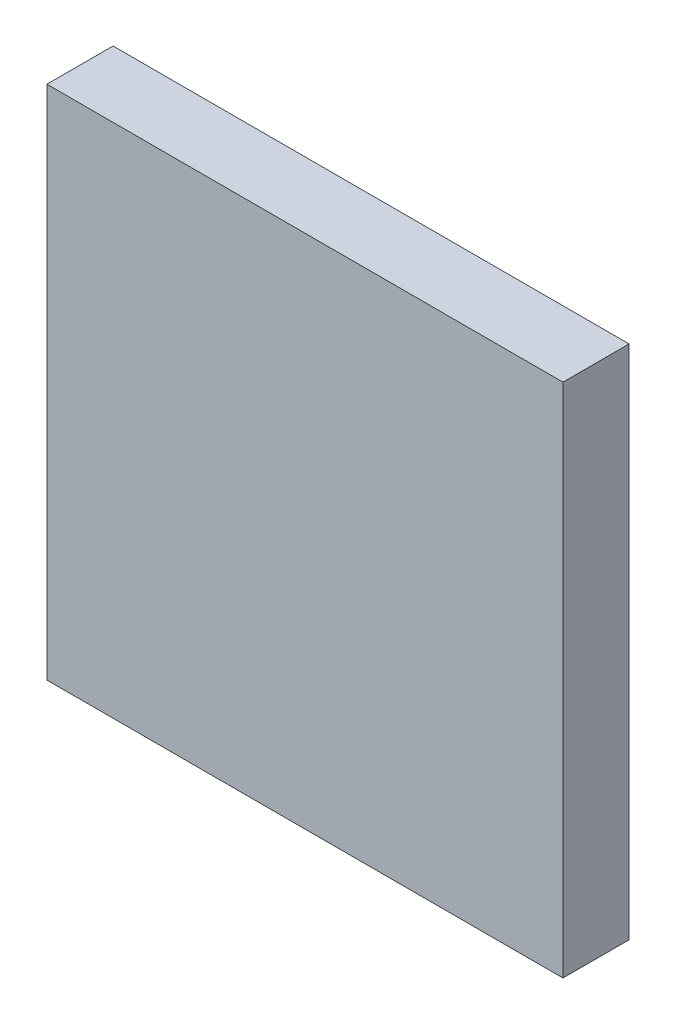
ISO-10303-21;
HEADER;
FILE_DESCRIPTION(('STEP AP214'),'2;1');
FILE_NAME('part.step','',(''),(''),'','','');
FILE_SCHEMA(('AUTOMOTIVE_DESIGN { 1 0 10303 214 1 1 1 1 }'));
ENDSEC;
DATA;
#1=APPLICATION_CONTEXT('core data for automotive mechanical design processes');
#2=APPLICATION_PROTOCOL_DEFINITION('international standard','automotive_design',2000,#1);
#3=PRODUCT_CONTEXT('',#1,'mechanical');
#4=PRODUCT('Part','Part','',(#3));
#5=PRODUCT_RELATED_PRODUCT_CATEGORY('part','',(#4));
#6=PRODUCT_DEFINITION_FORMATION('','',#4);
#7=PRODUCT_DEFINITION_CONTEXT('part definition',#1,'design');
#8=PRODUCT_DEFINITION('design','',#6,#7);
#9=PRODUCT_DEFINITION_SHAPE('','',#8);
#10=(LENGTH_UNIT() NAMED_UNIT(*) SI_UNIT(.MILLI.,.METRE.));
#11=(NAMED_UNIT(*) PLANE_ANGLE_UNIT() SI_UNIT($,.RADIAN.));
#12=(NAMED_UNIT(*) SI_UNIT($,.STERADIAN.) SOLID_ANGLE_UNIT());
#13=UNCERTAINTY_MEASURE_WITH_UNIT(LENGTH_MEASURE(1.E-05),#10,'distance_accuracy_value','');
#14=(GEOMETRIC_REPRESENTATION_CONTEXT(3) GLOBAL_UNCERTAINTY_ASSIGNED_CONTEXT((#13)) GLOBAL_UNIT_ASSIGNED_CONTEXT((#10,
#11,#12)) REPRESENTATION_CONTEXT('',''));
#15=CARTESIAN_POINT('',(0.,0.,0.));
#16=DIRECTION('',(0.,0.,1.));
#17=DIRECTION('',(1.,0.,0.));
#18=AXIS2_PLACEMENT_3D('',#15,#16,#17);
#19=CARTESIAN_POINT('',(0.,0.,5.));
#20=DIRECTION('',(1.,0.,0.));
#21=DIRECTION('',(0.,0.,-1.));
#22=AXIS2_PLACEMENT_3D('',#19,#20,#21);
#23=PLANE('',#22);
#24=DIRECTION('',(0.,-1.,0.));
#25=VECTOR('',#24,1.);
#26=CARTESIAN_POINT('',(0.,0.,0.));
#27=LINE('',#26,#25);
#28=CARTESIAN_POINT('',(0.,39.,0.));
#29=VERTEX_POINT('',#28);
#30=CARTESIAN_POINT('',(0.,0.,0.));
#31=VERTEX_POINT('',#30);
#32=EDGE_CURVE('E96',#29,#31,#27,.T.);
#33=ORIENTED_EDGE('',*,*,#32,.T.);
#34=DIRECTION('',(0.,0.,-1.));
#35=VECTOR('',#34,1.);
#36=CARTESIAN_POINT('',(0.,0.,5.));
#37=LINE('',#36,#35);
#38=CARTESIAN_POINT('',(0.,0.,5.));
#39=VERTEX_POINT('',#38);
#40=EDGE_CURVE('E11',#39,#31,#37,.T.);
#41=ORIENTED_EDGE('',*,*,#40,.F.);
#42=DIRECTION('',(0.,-1.,0.));
#43=VECTOR('',#42,1.);
#44=CARTESIAN_POINT('',(0.,0.,5.));
#45=LINE('',#44,#43);
#46=CARTESIAN_POINT('',(0.,39.,5.));
#47=VERTEX_POINT('',#46);
#48=EDGE_CURVE('E84',#47,#39,#45,.T.);
#49=ORIENTED_EDGE('',*,*,#48,.F.);
#50=DIRECTION('',(0.,0.,-1.));
#51=VECTOR('',#50,1.);
#52=CARTESIAN_POINT('',(0.,39.,5.));
#53=LINE('',#52,#51);
#54=EDGE_CURVE('E92',#47,#29,#53,.T.);
#55=ORIENTED_EDGE('',*,*,#54,.T.);
#56=EDGE_LOOP('',(#33,#41,#49,#55));
#57=FACE_BOUND('',#56,.T.);
#58=ADVANCED_FACE('F33',(#57),#23,.F.);
#59=CARTESIAN_POINT('',(0.,0.,5.));
#60=DIRECTION('',(0.,1.,0.));
#61=DIRECTION('',(0.,0.,1.));
#62=AXIS2_PLACEMENT_3D('',#59,#60,#61);
#63=PLANE('',#62);
#64=DIRECTION('',(1.,0.,0.));
#65=VECTOR('',#64,1.);
#66=CARTESIAN_POINT('',(0.,0.,0.));
#67=LINE('',#66,#65);
#68=CARTESIAN_POINT('',(39.,0.,0.));
#69=VERTEX_POINT('',#68);
#70=EDGE_CURVE('E88',#31,#69,#67,.T.);
#71=ORIENTED_EDGE('',*,*,#70,.T.);
#72=DIRECTION('',(0.,0.,-1.));
#73=VECTOR('',#72,1.);
#74=CARTESIAN_POINT('',(39.,0.,5.));
#75=LINE('',#74,#73);
#76=CARTESIAN_POINT('',(39.,0.,5.));
#77=VERTEX_POINT('',#76);
#78=EDGE_CURVE('E41',#77,#69,#75,.T.);
#79=ORIENTED_EDGE('',*,*,#78,.F.);
#80=DIRECTION('',(1.,0.,0.));
#81=VECTOR('',#80,1.);
#82=CARTESIAN_POINT('',(0.,0.,5.));
#83=LINE('',#82,#81);
#84=EDGE_CURVE('E79',#39,#77,#83,.T.);
#85=ORIENTED_EDGE('',*,*,#84,.F.);
#86=ORIENTED_EDGE('',*,*,#40,.T.);
#87=EDGE_LOOP('',(#71,#79,#85,#86));
#88=FACE_BOUND('',#87,.T.);
#89=ADVANCED_FACE('F87',(#88),#63,.F.);
#90=CARTESIAN_POINT('',(39.,0.,5.));
#91=DIRECTION('',(-1.,0.,0.));
#92=DIRECTION('',(0.,0.,1.));
#93=AXIS2_PLACEMENT_3D('',#90,#91,#92);
#94=PLANE('',#93);
#95=DIRECTION('',(0.,1.,0.));
#96=VECTOR('',#95,1.);
#97=CARTESIAN_POINT('',(39.,0.,0.));
#98=LINE('',#97,#96);
#99=CARTESIAN_POINT('',(39.,39.,0.));
#100=VERTEX_POINT('',#99);
#101=EDGE_CURVE('E66',#69,#100,#98,.T.);
#102=ORIENTED_EDGE('',*,*,#101,.T.);
#103=DIRECTION('',(0.,0.,-1.));
#104=VECTOR('',#103,1.);
#105=CARTESIAN_POINT('',(39.,39.,5.));
#106=LINE('',#105,#104);
#107=CARTESIAN_POINT('',(39.,39.,5.));
#108=VERTEX_POINT('',#107);
#109=EDGE_CURVE('E89',#108,#100,#106,.T.);
#110=ORIENTED_EDGE('',*,*,#109,.F.);
#111=DIRECTION('',(0.,1.,0.));
#112=VECTOR('',#111,1.);
#113=CARTESIAN_POINT('',(39.,0.,5.));
#114=LINE('',#113,#112);
#115=EDGE_CURVE('E82',#77,#108,#114,.T.);
#116=ORIENTED_EDGE('',*,*,#115,.F.);
#117=ORIENTED_EDGE('',*,*,#78,.T.);
#118=EDGE_LOOP('',(#102,#110,#116,#117));
#119=FACE_BOUND('',#118,.T.);
#120=ADVANCED_FACE('F90',(#119),#94,.F.);
#121=CARTESIAN_POINT('',(0.,39.,5.));
#122=DIRECTION('',(0.,-1.,0.));
#123=DIRECTION('',(0.,0.,-1.));
#124=AXIS2_PLACEMENT_3D('',#121,#122,#123);
#125=PLANE('',#124);
#126=DIRECTION('',(-1.,0.,0.));
#127=VECTOR('',#126,1.);
#128=CARTESIAN_POINT('',(0.,39.,0.));
#129=LINE('',#128,#127);
#130=EDGE_CURVE('E72',#100,#29,#129,.T.);
#131=ORIENTED_EDGE('',*,*,#130,.T.);
#132=ORIENTED_EDGE('',*,*,#54,.F.);
#133=DIRECTION('',(-1.,0.,0.));
#134=VECTOR('',#133,1.);
#135=CARTESIAN_POINT('',(0.,39.,5.));
#136=LINE('',#135,#134);
#137=EDGE_CURVE('E49',#108,#47,#136,.T.);
#138=ORIENTED_EDGE('',*,*,#137,.F.);
#139=ORIENTED_EDGE('',*,*,#109,.T.);
#140=EDGE_LOOP('',(#131,#132,#138,#139));
#141=FACE_BOUND('',#140,.T.);
#142=ADVANCED_FACE('F103',(#141),#125,.F.);
#143=CARTESIAN_POINT('',(0.,0.,5.));
#144=DIRECTION('',(0.,0.,-1.));
#145=DIRECTION('',(-1.,0.,0.));
#146=AXIS2_PLACEMENT_3D('',#143,#144,#145);
#147=PLANE('',#146);
#148=ORIENTED_EDGE('',*,*,#48,.T.);
#149=ORIENTED_EDGE('',*,*,#84,.T.);
#150=ORIENTED_EDGE('',*,*,#115,.T.);
#151=ORIENTED_EDGE('',*,*,#137,.T.);
#152=EDGE_LOOP('',(#148,#149,#150,#151));
#153=FACE_BOUND('',#152,.T.);
#154=ADVANCED_FACE('F80',(#153),#147,.F.);
#155=CARTESIAN_POINT('',(0.,0.,0.));
#156=DIRECTION('',(0.,0.,-1.));
#157=DIRECTION('',(-1.,0.,0.));
#158=AXIS2_PLACEMENT_3D('',#155,#156,#157);
#159=PLANE('',#158);
#160=ORIENTED_EDGE('',*,*,#32,.F.);
#161=ORIENTED_EDGE('',*,*,#130,.F.);
#162=ORIENTED_EDGE('',*,*,#101,.F.);
#163=ORIENTED_EDGE('',*,*,#70,.F.);
#164=EDGE_LOOP('',(#160,#161,#162,#163));
#165=FACE_BOUND('',#164,.T.);
#166=ADVANCED_FACE('F106',(#165),#159,.T.);
#167=CLOSED_SHELL('',(#58,#89,#120,#142,#154,#166));
#168=MANIFOLD_SOLID_BREP('B2',#167);
#169=ADVANCED_BREP_SHAPE_REPRESENTATION('',(#18,#168),#14);
#170=SHAPE_DEFINITION_REPRESENTATION(#9,#169);
ENDSEC;
END-ISO-10303-21;
